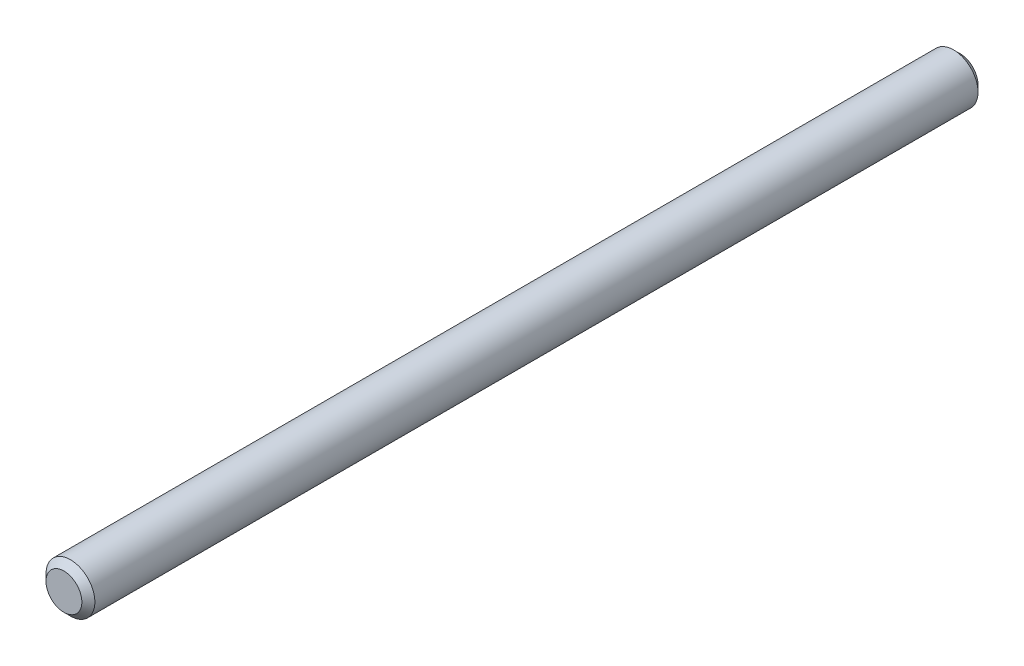
ISO-10303-21;
HEADER;
FILE_DESCRIPTION(('STEP AP214'),'2;1');
FILE_NAME('part.step','',(''),(''),'','','');
FILE_SCHEMA(('AUTOMOTIVE_DESIGN { 1 0 10303 214 1 1 1 1 }'));
ENDSEC;
DATA;
#1=APPLICATION_CONTEXT('core data for automotive mechanical design processes');
#2=APPLICATION_PROTOCOL_DEFINITION('international standard','automotive_design',2000,#1);
#3=PRODUCT_CONTEXT('',#1,'mechanical');
#4=PRODUCT('Part','Part','',(#3));
#5=PRODUCT_RELATED_PRODUCT_CATEGORY('part','',(#4));
#6=PRODUCT_DEFINITION_FORMATION('','',#4);
#7=PRODUCT_DEFINITION_CONTEXT('part definition',#1,'design');
#8=PRODUCT_DEFINITION('design','',#6,#7);
#9=PRODUCT_DEFINITION_SHAPE('','',#8);
#10=(LENGTH_UNIT() NAMED_UNIT(*) SI_UNIT(.MILLI.,.METRE.));
#11=(NAMED_UNIT(*) PLANE_ANGLE_UNIT() SI_UNIT($,.RADIAN.));
#12=(NAMED_UNIT(*) SI_UNIT($,.STERADIAN.) SOLID_ANGLE_UNIT());
#13=UNCERTAINTY_MEASURE_WITH_UNIT(LENGTH_MEASURE(1.E-05),#10,'distance_accuracy_value','');
#14=(GEOMETRIC_REPRESENTATION_CONTEXT(3) GLOBAL_UNCERTAINTY_ASSIGNED_CONTEXT((#13)) GLOBAL_UNIT_ASSIGNED_CONTEXT((#10,
#11,#12)) REPRESENTATION_CONTEXT('',''));
#15=CARTESIAN_POINT('',(0.,0.,0.));
#16=DIRECTION('',(0.,0.,1.));
#17=DIRECTION('',(1.,0.,0.));
#18=AXIS2_PLACEMENT_3D('',#15,#16,#17);
#19=CARTESIAN_POINT('',(0.,0.,137.5));
#20=DIRECTION('',(0.,0.,-1.));
#21=DIRECTION('',(-1.,0.,0.));
#22=AXIS2_PLACEMENT_3D('',#19,#20,#21);
#23=CYLINDRICAL_SURFACE('',#22,7.5);
#24=CARTESIAN_POINT('',(0.,0.,-135.5));
#25=DIRECTION('',(0.,0.,1.));
#26=DIRECTION('',(1.,0.,0.));
#27=AXIS2_PLACEMENT_3D('',#24,#25,#26);
#28=CIRCLE('',#27,7.5);
#29=CARTESIAN_POINT('',(7.5,0.,-135.5));
#30=VERTEX_POINT('',#29);
#31=EDGE_CURVE('E42',#30,#30,#28,.T.);
#32=ORIENTED_EDGE('',*,*,#31,.T.);
#33=EDGE_LOOP('',(#32));
#34=FACE_BOUND('',#33,.T.);
#35=CARTESIAN_POINT('',(0.,0.,135.5));
#36=DIRECTION('',(0.,0.,1.));
#37=DIRECTION('',(1.,0.,0.));
#38=AXIS2_PLACEMENT_3D('',#35,#36,#37);
#39=CIRCLE('',#38,7.5);
#40=CARTESIAN_POINT('',(7.5,0.,135.5));
#41=VERTEX_POINT('',#40);
#42=EDGE_CURVE('E46',#41,#41,#39,.F.);
#43=ORIENTED_EDGE('',*,*,#42,.T.);
#44=EDGE_LOOP('',(#43));
#45=FACE_BOUND('',#44,.T.);
#46=ADVANCED_FACE('F31',(#34,#45),#23,.T.);
#47=CARTESIAN_POINT('',(0.,0.,137.5));
#48=DIRECTION('',(0.,0.,1.));
#49=DIRECTION('',(1.,0.,0.));
#50=AXIS2_PLACEMENT_3D('',#47,#48,#49);
#51=PLANE('',#50);
#52=CARTESIAN_POINT('',(0.,0.,137.5));
#53=DIRECTION('',(0.,0.,1.));
#54=DIRECTION('',(1.,0.,0.));
#55=AXIS2_PLACEMENT_3D('',#52,#53,#54);
#56=CIRCLE('',#55,5.50000000000001);
#57=CARTESIAN_POINT('',(5.50000000000001,0.,137.5));
#58=VERTEX_POINT('',#57);
#59=EDGE_CURVE('E10',#58,#58,#56,.T.);
#60=ORIENTED_EDGE('',*,*,#59,.T.);
#61=EDGE_LOOP('',(#60));
#62=FACE_BOUND('',#61,.T.);
#63=ADVANCED_FACE('F62',(#62),#51,.T.);
#64=CARTESIAN_POINT('',(0.,0.,-137.5));
#65=DIRECTION('',(0.,0.,1.));
#66=DIRECTION('',(1.,0.,0.));
#67=AXIS2_PLACEMENT_3D('',#64,#65,#66);
#68=PLANE('',#67);
#69=CARTESIAN_POINT('',(0.,0.,-137.5));
#70=DIRECTION('',(0.,0.,1.));
#71=DIRECTION('',(1.,0.,0.));
#72=AXIS2_PLACEMENT_3D('',#69,#70,#71);
#73=CIRCLE('',#72,5.50000000000003);
#74=CARTESIAN_POINT('',(5.50000000000003,0.,-137.5));
#75=VERTEX_POINT('',#74);
#76=EDGE_CURVE('E38',#75,#75,#73,.F.);
#77=ORIENTED_EDGE('',*,*,#76,.T.);
#78=EDGE_LOOP('',(#77));
#79=FACE_BOUND('',#78,.T.);
#80=ADVANCED_FACE('F59',(#79),#68,.F.);
#81=CARTESIAN_POINT('',(0.,0.,-135.5));
#82=DIRECTION('',(0.,0.,1.));
#83=DIRECTION('',(1.,0.,0.));
#84=AXIS2_PLACEMENT_3D('',#81,#82,#83);
#85=CONICAL_SURFACE('',#84,7.5,0.78539816339744);
#86=ORIENTED_EDGE('',*,*,#76,.F.);
#87=EDGE_LOOP('',(#86));
#88=FACE_BOUND('',#87,.T.);
#89=ORIENTED_EDGE('',*,*,#31,.F.);
#90=EDGE_LOOP('',(#89));
#91=FACE_BOUND('',#90,.T.);
#92=ADVANCED_FACE('F55',(#88,#91),#85,.T.);
#93=CARTESIAN_POINT('',(0.,0.,137.5));
#94=DIRECTION('',(0.,0.,-1.));
#95=DIRECTION('',(-1.,0.,0.));
#96=AXIS2_PLACEMENT_3D('',#93,#94,#95);
#97=CONICAL_SURFACE('',#96,5.50000000000001,0.78539816339744);
#98=ORIENTED_EDGE('',*,*,#42,.F.);
#99=EDGE_LOOP('',(#98));
#100=FACE_BOUND('',#99,.T.);
#101=ORIENTED_EDGE('',*,*,#59,.F.);
#102=EDGE_LOOP('',(#101));
#103=FACE_BOUND('',#102,.T.);
#104=ADVANCED_FACE('F33',(#100,#103),#97,.T.);
#105=CLOSED_SHELL('',(#46,#63,#80,#92,#104));
#106=MANIFOLD_SOLID_BREP('B2',#105);
#107=ADVANCED_BREP_SHAPE_REPRESENTATION('',(#18,#106),#14);
#108=SHAPE_DEFINITION_REPRESENTATION(#9,#107);
ENDSEC;
END-ISO-10303-21;
